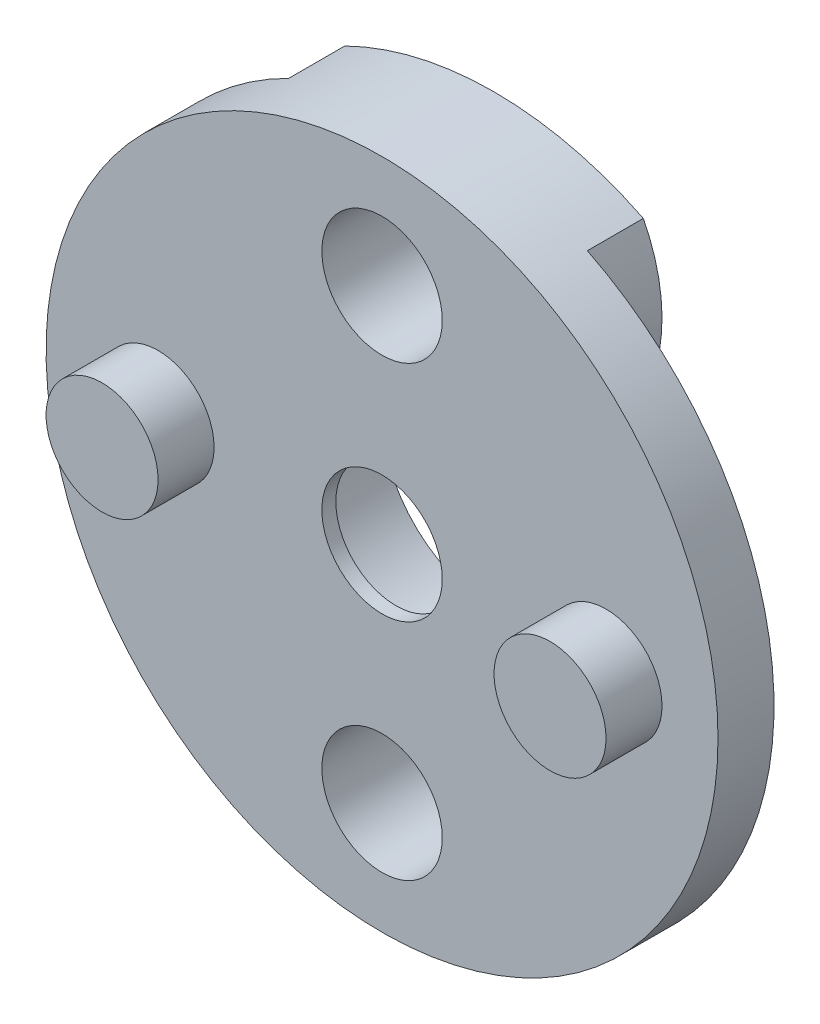
ISO-10303-21;
HEADER;
FILE_DESCRIPTION(('STEP AP214'),'2;1');
FILE_NAME('part.step','',(''),(''),'','','');
FILE_SCHEMA(('AUTOMOTIVE_DESIGN { 1 0 10303 214 1 1 1 1 }'));
ENDSEC;
DATA;
#1=APPLICATION_CONTEXT('core data for automotive mechanical design processes');
#2=APPLICATION_PROTOCOL_DEFINITION('international standard','automotive_design',2000,#1);
#3=PRODUCT_CONTEXT('',#1,'mechanical');
#4=PRODUCT('Part','Part','',(#3));
#5=PRODUCT_RELATED_PRODUCT_CATEGORY('part','',(#4));
#6=PRODUCT_DEFINITION_FORMATION('','',#4);
#7=PRODUCT_DEFINITION_CONTEXT('part definition',#1,'design');
#8=PRODUCT_DEFINITION('design','',#6,#7);
#9=PRODUCT_DEFINITION_SHAPE('','',#8);
#10=(LENGTH_UNIT() NAMED_UNIT(*) SI_UNIT(.MILLI.,.METRE.));
#11=(NAMED_UNIT(*) PLANE_ANGLE_UNIT() SI_UNIT($,.RADIAN.));
#12=(NAMED_UNIT(*) SI_UNIT($,.STERADIAN.) SOLID_ANGLE_UNIT());
#13=UNCERTAINTY_MEASURE_WITH_UNIT(LENGTH_MEASURE(1.E-05),#10,'distance_accuracy_value','');
#14=(GEOMETRIC_REPRESENTATION_CONTEXT(3) GLOBAL_UNCERTAINTY_ASSIGNED_CONTEXT((#13)) GLOBAL_UNIT_ASSIGNED_CONTEXT((#10,
#11,#12)) REPRESENTATION_CONTEXT('',''));
#15=CARTESIAN_POINT('',(0.,0.,0.));
#16=DIRECTION('',(0.,0.,1.));
#17=DIRECTION('',(1.,0.,0.));
#18=AXIS2_PLACEMENT_3D('',#15,#16,#17);
#19=CARTESIAN_POINT('',(0.,0.,2.));
#20=DIRECTION('',(0.,0.,1.));
#21=DIRECTION('',(1.,0.,0.));
#22=AXIS2_PLACEMENT_3D('',#19,#20,#21);
#23=CYLINDRICAL_SURFACE('',#22,2.14999999999999);
#24=CARTESIAN_POINT('',(0.,0.,2.));
#25=DIRECTION('',(0.,0.,1.));
#26=DIRECTION('',(1.,0.,0.));
#27=AXIS2_PLACEMENT_3D('',#24,#25,#26);
#28=CIRCLE('',#27,2.14999999999999);
#29=CARTESIAN_POINT('',(2.14999999999999,0.,2.));
#30=VERTEX_POINT('',#29);
#31=EDGE_CURVE('E128',#30,#30,#28,.T.);
#32=ORIENTED_EDGE('',*,*,#31,.T.);
#33=EDGE_LOOP('',(#32));
#34=FACE_BOUND('',#33,.T.);
#35=CARTESIAN_POINT('',(0.,0.,1.5));
#36=DIRECTION('',(0.,0.,-1.));
#37=DIRECTION('',(-1.,0.,0.));
#38=AXIS2_PLACEMENT_3D('',#35,#36,#37);
#39=CIRCLE('',#38,2.14999999999999);
#40=CARTESIAN_POINT('',(-2.14999999999999,0.,1.5));
#41=VERTEX_POINT('',#40);
#42=EDGE_CURVE('E39',#41,#41,#39,.F.);
#43=ORIENTED_EDGE('',*,*,#42,.F.);
#44=EDGE_LOOP('',(#43));
#45=FACE_BOUND('',#44,.T.);
#46=ADVANCED_FACE('F35',(#34,#45),#23,.F.);
#47=CARTESIAN_POINT('',(0.,0.,0.));
#48=DIRECTION('',(0.,0.,1.));
#49=DIRECTION('',(1.,0.,0.));
#50=AXIS2_PLACEMENT_3D('',#47,#48,#49);
#51=PLANE('',#50);
#52=CARTESIAN_POINT('',(0.,8.,0.));
#53=DIRECTION('',(0.,0.,-1.));
#54=DIRECTION('',(-1.,0.,0.));
#55=AXIS2_PLACEMENT_3D('',#52,#53,#54);
#56=CIRCLE('',#55,6.);
#57=CARTESIAN_POINT('',(-4.47213595499958,4.,0.));
#58=VERTEX_POINT('',#57);
#59=CARTESIAN_POINT('',(-5.33268225192539,10.75,0.));
#60=VERTEX_POINT('',#59);
#61=EDGE_CURVE('E52',#58,#60,#56,.T.);
#62=ORIENTED_EDGE('',*,*,#61,.F.);
#63=CARTESIAN_POINT('',(0.,0.,0.));
#64=DIRECTION('',(0.,0.,-1.));
#65=DIRECTION('',(-1.,0.,0.));
#66=AXIS2_PLACEMENT_3D('',#63,#64,#65);
#67=CIRCLE('',#66,6.);
#68=CARTESIAN_POINT('',(-4.47213595499958,-4.,0.));
#69=VERTEX_POINT('',#68);
#70=EDGE_CURVE('E56',#69,#58,#67,.T.);
#71=ORIENTED_EDGE('',*,*,#70,.F.);
#72=CARTESIAN_POINT('',(0.,-8.,0.));
#73=DIRECTION('',(0.,0.,-1.));
#74=DIRECTION('',(-1.,0.,0.));
#75=AXIS2_PLACEMENT_3D('',#72,#73,#74);
#76=CIRCLE('',#75,6.);
#77=CARTESIAN_POINT('',(-5.33268225192539,-10.75,0.));
#78=VERTEX_POINT('',#77);
#79=EDGE_CURVE('E160',#78,#69,#76,.T.);
#80=ORIENTED_EDGE('',*,*,#79,.F.);
#81=CARTESIAN_POINT('',(0.,0.,0.));
#82=DIRECTION('',(0.,0.,1.));
#83=DIRECTION('',(1.,0.,0.));
#84=AXIS2_PLACEMENT_3D('',#81,#82,#83);
#85=CIRCLE('',#84,12.);
#86=EDGE_CURVE('E44',#60,#78,#85,.T.);
#87=ORIENTED_EDGE('',*,*,#86,.F.);
#88=EDGE_LOOP('',(#62,#71,#80,#87));
#89=FACE_BOUND('',#88,.T.);
#90=ADVANCED_FACE('F227',(#89),#51,.F.);
#91=CARTESIAN_POINT('',(0.,0.,2.));
#92=DIRECTION('',(0.,0.,-1.));
#93=DIRECTION('',(-1.,0.,0.));
#94=AXIS2_PLACEMENT_3D('',#91,#92,#93);
#95=CYLINDRICAL_SURFACE('',#94,12.);
#96=CARTESIAN_POINT('',(0.,0.,2.));
#97=DIRECTION('',(0.,0.,1.));
#98=DIRECTION('',(1.,0.,0.));
#99=AXIS2_PLACEMENT_3D('',#96,#97,#98);
#100=CIRCLE('',#99,12.);
#101=CARTESIAN_POINT('',(12.,0.,2.));
#102=VERTEX_POINT('',#101);
#103=EDGE_CURVE('E11',#102,#102,#100,.T.);
#104=ORIENTED_EDGE('',*,*,#103,.F.);
#105=EDGE_LOOP('',(#104));
#106=FACE_BOUND('',#105,.T.);
#107=CARTESIAN_POINT('',(5.33268225192539,-10.75,0.));
#108=VERTEX_POINT('',#107);
#109=CARTESIAN_POINT('',(5.33268225192539,10.75,0.));
#110=VERTEX_POINT('',#109);
#111=EDGE_CURVE('E124',#108,#110,#85,.T.);
#112=ORIENTED_EDGE('',*,*,#111,.T.);
#113=DIRECTION('',(0.,0.,1.));
#114=VECTOR('',#113,1.);
#115=CARTESIAN_POINT('',(5.33268225192538,10.75,-2.));
#116=LINE('',#115,#114);
#117=CARTESIAN_POINT('',(5.33268225192538,10.75,-2.));
#118=VERTEX_POINT('',#117);
#119=EDGE_CURVE('E105',#118,#110,#116,.T.);
#120=ORIENTED_EDGE('',*,*,#119,.F.);
#121=CARTESIAN_POINT('',(0.,0.,-2.));
#122=DIRECTION('',(0.,0.,-1.));
#123=DIRECTION('',(-1.,0.,0.));
#124=AXIS2_PLACEMENT_3D('',#121,#122,#123);
#125=CIRCLE('',#124,12.);
#126=CARTESIAN_POINT('',(-5.33268225192538,10.75,-2.));
#127=VERTEX_POINT('',#126);
#128=EDGE_CURVE('E111',#127,#118,#125,.T.);
#129=ORIENTED_EDGE('',*,*,#128,.F.);
#130=DIRECTION('',(0.,0.,1.));
#131=VECTOR('',#130,1.);
#132=CARTESIAN_POINT('',(-5.33268225192538,10.75,-2.));
#133=LINE('',#132,#131);
#134=EDGE_CURVE('E156',#127,#60,#133,.T.);
#135=ORIENTED_EDGE('',*,*,#134,.T.);
#136=ORIENTED_EDGE('',*,*,#86,.T.);
#137=DIRECTION('',(0.,0.,1.));
#138=VECTOR('',#137,1.);
#139=CARTESIAN_POINT('',(-5.33268225192538,-10.75,-2.));
#140=LINE('',#139,#138);
#141=CARTESIAN_POINT('',(-5.33268225192538,-10.75,-2.));
#142=VERTEX_POINT('',#141);
#143=EDGE_CURVE('E154',#142,#78,#140,.T.);
#144=ORIENTED_EDGE('',*,*,#143,.F.);
#145=CARTESIAN_POINT('',(0.,0.,-2.));
#146=DIRECTION('',(0.,0.,-1.));
#147=DIRECTION('',(-1.,0.,0.));
#148=AXIS2_PLACEMENT_3D('',#145,#146,#147);
#149=CIRCLE('',#148,12.);
#150=CARTESIAN_POINT('',(5.33268225192539,-10.75,-2.));
#151=VERTEX_POINT('',#150);
#152=EDGE_CURVE('E203',#151,#142,#149,.T.);
#153=ORIENTED_EDGE('',*,*,#152,.F.);
#154=DIRECTION('',(0.,0.,1.));
#155=VECTOR('',#154,1.);
#156=CARTESIAN_POINT('',(5.33268225192539,-10.75,-2.));
#157=LINE('',#156,#155);
#158=EDGE_CURVE('E163',#151,#108,#157,.T.);
#159=ORIENTED_EDGE('',*,*,#158,.T.);
#160=EDGE_LOOP('',(#112,#120,#129,#135,#136,#144,#153,#159));
#161=FACE_BOUND('',#160,.T.);
#162=ADVANCED_FACE('F37',(#106,#161),#95,.T.);
#163=CARTESIAN_POINT('',(0.,0.,2.));
#164=DIRECTION('',(0.,0.,1.));
#165=DIRECTION('',(1.,0.,0.));
#166=AXIS2_PLACEMENT_3D('',#163,#164,#165);
#167=PLANE('',#166);
#168=CARTESIAN_POINT('',(0.,8.,2.));
#169=DIRECTION('',(0.,0.,1.));
#170=DIRECTION('',(1.,0.,0.));
#171=AXIS2_PLACEMENT_3D('',#168,#169,#170);
#172=CIRCLE('',#171,2.14999999999999);
#173=CARTESIAN_POINT('',(2.14999999999999,8.,2.));
#174=VERTEX_POINT('',#173);
#175=EDGE_CURVE('E125',#174,#174,#172,.T.);
#176=ORIENTED_EDGE('',*,*,#175,.F.);
#177=EDGE_LOOP('',(#176));
#178=FACE_BOUND('',#177,.T.);
#179=ORIENTED_EDGE('',*,*,#31,.F.);
#180=EDGE_LOOP('',(#179));
#181=FACE_BOUND('',#180,.T.);
#182=CARTESIAN_POINT('',(0.,-8.,2.));
#183=DIRECTION('',(0.,0.,1.));
#184=DIRECTION('',(1.,0.,0.));
#185=AXIS2_PLACEMENT_3D('',#182,#183,#184);
#186=CIRCLE('',#185,2.14999999999999);
#187=CARTESIAN_POINT('',(2.14999999999999,-8.,2.));
#188=VERTEX_POINT('',#187);
#189=EDGE_CURVE('E136',#188,#188,#186,.T.);
#190=ORIENTED_EDGE('',*,*,#189,.F.);
#191=EDGE_LOOP('',(#190));
#192=FACE_BOUND('',#191,.T.);
#193=CARTESIAN_POINT('',(8.,0.,2.));
#194=DIRECTION('',(0.,0.,1.));
#195=DIRECTION('',(1.,0.,0.));
#196=AXIS2_PLACEMENT_3D('',#193,#194,#195);
#197=CIRCLE('',#196,2.);
#198=CARTESIAN_POINT('',(10.,0.,2.));
#199=VERTEX_POINT('',#198);
#200=EDGE_CURVE('E139',#199,#199,#197,.T.);
#201=ORIENTED_EDGE('',*,*,#200,.F.);
#202=EDGE_LOOP('',(#201));
#203=FACE_BOUND('',#202,.T.);
#204=CARTESIAN_POINT('',(-8.,0.,2.));
#205=DIRECTION('',(0.,0.,1.));
#206=DIRECTION('',(1.,0.,0.));
#207=AXIS2_PLACEMENT_3D('',#204,#205,#206);
#208=CIRCLE('',#207,2.);
#209=CARTESIAN_POINT('',(-6.,0.,2.));
#210=VERTEX_POINT('',#209);
#211=EDGE_CURVE('E143',#210,#210,#208,.T.);
#212=ORIENTED_EDGE('',*,*,#211,.F.);
#213=EDGE_LOOP('',(#212));
#214=FACE_BOUND('',#213,.T.);
#215=ORIENTED_EDGE('',*,*,#103,.T.);
#216=EDGE_LOOP('',(#215));
#217=FACE_BOUND('',#216,.T.);
#218=ADVANCED_FACE('F258',(#178,#181,#192,#203,#214,#217),#167,.T.);
#219=CARTESIAN_POINT('',(0.,-8.,0.));
#220=DIRECTION('',(0.,0.,-1.));
#221=DIRECTION('',(-1.,0.,0.));
#222=AXIS2_PLACEMENT_3D('',#219,#220,#221);
#223=CIRCLE('',#222,6.);
#224=CARTESIAN_POINT('',(4.47213595499958,-4.,0.));
#225=VERTEX_POINT('',#224);
#226=EDGE_CURVE('E177',#225,#108,#223,.T.);
#227=ORIENTED_EDGE('',*,*,#226,.F.);
#228=CARTESIAN_POINT('',(0.,0.,0.));
#229=DIRECTION('',(0.,0.,-1.));
#230=DIRECTION('',(-1.,0.,0.));
#231=AXIS2_PLACEMENT_3D('',#228,#229,#230);
#232=CIRCLE('',#231,6.);
#233=CARTESIAN_POINT('',(4.47213595499958,4.,0.));
#234=VERTEX_POINT('',#233);
#235=EDGE_CURVE('E182',#234,#225,#232,.T.);
#236=ORIENTED_EDGE('',*,*,#235,.F.);
#237=CARTESIAN_POINT('',(0.,8.,0.));
#238=DIRECTION('',(0.,0.,-1.));
#239=DIRECTION('',(-1.,0.,0.));
#240=AXIS2_PLACEMENT_3D('',#237,#238,#239);
#241=CIRCLE('',#240,6.);
#242=EDGE_CURVE('E184',#110,#234,#241,.T.);
#243=ORIENTED_EDGE('',*,*,#242,.F.);
#244=ORIENTED_EDGE('',*,*,#111,.F.);
#245=EDGE_LOOP('',(#227,#236,#243,#244));
#246=FACE_BOUND('',#245,.T.);
#247=ADVANCED_FACE('F233',(#246),#51,.F.);
#248=CARTESIAN_POINT('',(-8.,0.,4.));
#249=DIRECTION('',(0.,0.,-1.));
#250=DIRECTION('',(-1.,0.,0.));
#251=AXIS2_PLACEMENT_3D('',#248,#249,#250);
#252=CYLINDRICAL_SURFACE('',#251,2.);
#253=CARTESIAN_POINT('',(-8.,0.,4.));
#254=DIRECTION('',(0.,0.,1.));
#255=DIRECTION('',(1.,0.,0.));
#256=AXIS2_PLACEMENT_3D('',#253,#254,#255);
#257=CIRCLE('',#256,2.);
#258=CARTESIAN_POINT('',(-6.,0.,4.));
#259=VERTEX_POINT('',#258);
#260=EDGE_CURVE('E146',#259,#259,#257,.T.);
#261=ORIENTED_EDGE('',*,*,#260,.F.);
#262=EDGE_LOOP('',(#261));
#263=FACE_BOUND('',#262,.T.);
#264=ORIENTED_EDGE('',*,*,#211,.T.);
#265=EDGE_LOOP('',(#264));
#266=FACE_BOUND('',#265,.T.);
#267=ADVANCED_FACE('F253',(#263,#266),#252,.T.);
#268=CARTESIAN_POINT('',(-8.,0.,4.));
#269=DIRECTION('',(0.,0.,1.));
#270=DIRECTION('',(1.,0.,0.));
#271=AXIS2_PLACEMENT_3D('',#268,#269,#270);
#272=PLANE('',#271);
#273=ORIENTED_EDGE('',*,*,#260,.T.);
#274=EDGE_LOOP('',(#273));
#275=FACE_BOUND('',#274,.T.);
#276=ADVANCED_FACE('F249',(#275),#272,.T.);
#277=CARTESIAN_POINT('',(8.,0.,4.));
#278=DIRECTION('',(0.,0.,-1.));
#279=DIRECTION('',(-1.,0.,0.));
#280=AXIS2_PLACEMENT_3D('',#277,#278,#279);
#281=CYLINDRICAL_SURFACE('',#280,2.);
#282=CARTESIAN_POINT('',(8.,0.,4.));
#283=DIRECTION('',(0.,0.,1.));
#284=DIRECTION('',(1.,0.,0.));
#285=AXIS2_PLACEMENT_3D('',#282,#283,#284);
#286=CIRCLE('',#285,2.);
#287=CARTESIAN_POINT('',(10.,0.,4.));
#288=VERTEX_POINT('',#287);
#289=EDGE_CURVE('E140',#288,#288,#286,.T.);
#290=ORIENTED_EDGE('',*,*,#289,.F.);
#291=EDGE_LOOP('',(#290));
#292=FACE_BOUND('',#291,.T.);
#293=ORIENTED_EDGE('',*,*,#200,.T.);
#294=EDGE_LOOP('',(#293));
#295=FACE_BOUND('',#294,.T.);
#296=ADVANCED_FACE('F245',(#292,#295),#281,.T.);
#297=CARTESIAN_POINT('',(8.,0.,4.));
#298=DIRECTION('',(0.,0.,1.));
#299=DIRECTION('',(1.,0.,0.));
#300=AXIS2_PLACEMENT_3D('',#297,#298,#299);
#301=PLANE('',#300);
#302=ORIENTED_EDGE('',*,*,#289,.T.);
#303=EDGE_LOOP('',(#302));
#304=FACE_BOUND('',#303,.T.);
#305=ADVANCED_FACE('F241',(#304),#301,.T.);
#306=CARTESIAN_POINT('',(0.,-8.,2.));
#307=DIRECTION('',(0.,0.,1.));
#308=DIRECTION('',(1.,0.,0.));
#309=AXIS2_PLACEMENT_3D('',#306,#307,#308);
#310=CYLINDRICAL_SURFACE('',#309,2.14999999999999);
#311=ORIENTED_EDGE('',*,*,#189,.T.);
#312=EDGE_LOOP('',(#311));
#313=FACE_BOUND('',#312,.T.);
#314=CARTESIAN_POINT('',(0.,-8.,-2.));
#315=DIRECTION('',(0.,0.,-1.));
#316=DIRECTION('',(-1.,0.,0.));
#317=AXIS2_PLACEMENT_3D('',#314,#315,#316);
#318=CIRCLE('',#317,2.15);
#319=CARTESIAN_POINT('',(-2.15,-8.,-2.));
#320=VERTEX_POINT('',#319);
#321=EDGE_CURVE('E211',#320,#320,#318,.T.);
#322=ORIENTED_EDGE('',*,*,#321,.T.);
#323=EDGE_LOOP('',(#322));
#324=FACE_BOUND('',#323,.T.);
#325=ADVANCED_FACE('F238',(#313,#324),#310,.F.);
#326=CARTESIAN_POINT('',(0.,8.,2.));
#327=DIRECTION('',(0.,0.,1.));
#328=DIRECTION('',(1.,0.,0.));
#329=AXIS2_PLACEMENT_3D('',#326,#327,#328);
#330=CYLINDRICAL_SURFACE('',#329,2.14999999999999);
#331=ORIENTED_EDGE('',*,*,#175,.T.);
#332=EDGE_LOOP('',(#331));
#333=FACE_BOUND('',#332,.T.);
#334=CARTESIAN_POINT('',(0.,8.,-2.));
#335=DIRECTION('',(0.,0.,-1.));
#336=DIRECTION('',(-1.,0.,0.));
#337=AXIS2_PLACEMENT_3D('',#334,#335,#336);
#338=CIRCLE('',#337,2.15);
#339=CARTESIAN_POINT('',(-2.15,8.,-2.));
#340=VERTEX_POINT('',#339);
#341=EDGE_CURVE('E187',#340,#340,#338,.T.);
#342=ORIENTED_EDGE('',*,*,#341,.T.);
#343=EDGE_LOOP('',(#342));
#344=FACE_BOUND('',#343,.T.);
#345=ADVANCED_FACE('F236',(#333,#344),#330,.F.);
#346=CARTESIAN_POINT('',(0.,4.,-2.));
#347=DIRECTION('',(0.,0.,-1.));
#348=DIRECTION('',(-1.,0.,0.));
#349=AXIS2_PLACEMENT_3D('',#346,#347,#348);
#350=PLANE('',#349);
#351=ORIENTED_EDGE('',*,*,#321,.F.);
#352=EDGE_LOOP('',(#351));
#353=FACE_BOUND('',#352,.T.);
#354=ORIENTED_EDGE('',*,*,#128,.T.);
#355=CARTESIAN_POINT('',(0.,8.,-2.));
#356=DIRECTION('',(0.,0.,-1.));
#357=DIRECTION('',(-1.,0.,0.));
#358=AXIS2_PLACEMENT_3D('',#355,#356,#357);
#359=CIRCLE('',#358,6.);
#360=CARTESIAN_POINT('',(4.47213595499958,4.,-2.));
#361=VERTEX_POINT('',#360);
#362=EDGE_CURVE('E100',#118,#361,#359,.T.);
#363=ORIENTED_EDGE('',*,*,#362,.T.);
#364=CARTESIAN_POINT('',(0.,0.,-2.));
#365=DIRECTION('',(0.,0.,-1.));
#366=DIRECTION('',(-1.,0.,0.));
#367=AXIS2_PLACEMENT_3D('',#364,#365,#366);
#368=CIRCLE('',#367,6.);
#369=CARTESIAN_POINT('',(4.47213595499958,-4.,-2.));
#370=VERTEX_POINT('',#369);
#371=EDGE_CURVE('E110',#361,#370,#368,.T.);
#372=ORIENTED_EDGE('',*,*,#371,.T.);
#373=CARTESIAN_POINT('',(0.,-8.,-2.));
#374=DIRECTION('',(0.,0.,-1.));
#375=DIRECTION('',(-1.,0.,0.));
#376=AXIS2_PLACEMENT_3D('',#373,#374,#375);
#377=CIRCLE('',#376,6.);
#378=EDGE_CURVE('E178',#370,#151,#377,.T.);
#379=ORIENTED_EDGE('',*,*,#378,.T.);
#380=ORIENTED_EDGE('',*,*,#152,.T.);
#381=CARTESIAN_POINT('',(0.,-8.,-2.));
#382=DIRECTION('',(0.,0.,-1.));
#383=DIRECTION('',(-1.,0.,0.));
#384=AXIS2_PLACEMENT_3D('',#381,#382,#383);
#385=CIRCLE('',#384,6.);
#386=CARTESIAN_POINT('',(-4.47213595499958,-4.,-2.));
#387=VERTEX_POINT('',#386);
#388=EDGE_CURVE('E162',#142,#387,#385,.T.);
#389=ORIENTED_EDGE('',*,*,#388,.T.);
#390=CARTESIAN_POINT('',(0.,0.,-2.));
#391=DIRECTION('',(0.,0.,-1.));
#392=DIRECTION('',(-1.,0.,0.));
#393=AXIS2_PLACEMENT_3D('',#390,#391,#392);
#394=CIRCLE('',#393,6.);
#395=CARTESIAN_POINT('',(-4.47213595499958,4.,-2.));
#396=VERTEX_POINT('',#395);
#397=EDGE_CURVE('E201',#387,#396,#394,.T.);
#398=ORIENTED_EDGE('',*,*,#397,.T.);
#399=CARTESIAN_POINT('',(0.,8.,-2.));
#400=DIRECTION('',(0.,0.,-1.));
#401=DIRECTION('',(-1.,0.,0.));
#402=AXIS2_PLACEMENT_3D('',#399,#400,#401);
#403=CIRCLE('',#402,6.);
#404=EDGE_CURVE('E117',#396,#127,#403,.T.);
#405=ORIENTED_EDGE('',*,*,#404,.T.);
#406=EDGE_LOOP('',(#354,#363,#372,#379,#380,#389,#398,#405));
#407=FACE_BOUND('',#406,.T.);
#408=ORIENTED_EDGE('',*,*,#341,.F.);
#409=EDGE_LOOP('',(#408));
#410=FACE_BOUND('',#409,.T.);
#411=CARTESIAN_POINT('',(0.,0.,-2.));
#412=DIRECTION('',(0.,0.,-1.));
#413=DIRECTION('',(-1.,0.,0.));
#414=AXIS2_PLACEMENT_3D('',#411,#412,#413);
#415=CIRCLE('',#414,4.);
#416=CARTESIAN_POINT('',(-4.,0.,-2.));
#417=VERTEX_POINT('',#416);
#418=EDGE_CURVE('E214',#417,#417,#415,.T.);
#419=ORIENTED_EDGE('',*,*,#418,.F.);
#420=EDGE_LOOP('',(#419));
#421=FACE_BOUND('',#420,.T.);
#422=ADVANCED_FACE('F114',(#353,#407,#410,#421),#350,.T.);
#423=CARTESIAN_POINT('',(0.,8.,-2.));
#424=DIRECTION('',(0.,0.,1.));
#425=DIRECTION('',(1.,0.,0.));
#426=AXIS2_PLACEMENT_3D('',#423,#424,#425);
#427=CYLINDRICAL_SURFACE('',#426,6.);
#428=ORIENTED_EDGE('',*,*,#242,.T.);
#429=DIRECTION('',(0.,0.,1.));
#430=VECTOR('',#429,1.);
#431=CARTESIAN_POINT('',(4.47213595499958,4.,-2.));
#432=LINE('',#431,#430);
#433=EDGE_CURVE('E107',#361,#234,#432,.T.);
#434=ORIENTED_EDGE('',*,*,#433,.F.);
#435=ORIENTED_EDGE('',*,*,#362,.F.);
#436=ORIENTED_EDGE('',*,*,#119,.T.);
#437=EDGE_LOOP('',(#428,#434,#435,#436));
#438=FACE_BOUND('',#437,.T.);
#439=ADVANCED_FACE('F103',(#438),#427,.T.);
#440=CARTESIAN_POINT('',(0.,0.,-2.));
#441=DIRECTION('',(0.,0.,1.));
#442=DIRECTION('',(1.,0.,0.));
#443=AXIS2_PLACEMENT_3D('',#440,#441,#442);
#444=CYLINDRICAL_SURFACE('',#443,6.);
#445=ORIENTED_EDGE('',*,*,#235,.T.);
#446=DIRECTION('',(0.,0.,1.));
#447=VECTOR('',#446,1.);
#448=CARTESIAN_POINT('',(4.47213595499958,-4.,-2.));
#449=LINE('',#448,#447);
#450=EDGE_CURVE('E130',#370,#225,#449,.T.);
#451=ORIENTED_EDGE('',*,*,#450,.F.);
#452=ORIENTED_EDGE('',*,*,#371,.F.);
#453=ORIENTED_EDGE('',*,*,#433,.T.);
#454=EDGE_LOOP('',(#445,#451,#452,#453));
#455=FACE_BOUND('',#454,.T.);
#456=ADVANCED_FACE('F181',(#455),#444,.T.);
#457=CARTESIAN_POINT('',(0.,-8.,-2.));
#458=DIRECTION('',(0.,0.,1.));
#459=DIRECTION('',(1.,0.,0.));
#460=AXIS2_PLACEMENT_3D('',#457,#458,#459);
#461=CYLINDRICAL_SURFACE('',#460,6.);
#462=ORIENTED_EDGE('',*,*,#226,.T.);
#463=ORIENTED_EDGE('',*,*,#158,.F.);
#464=ORIENTED_EDGE('',*,*,#378,.F.);
#465=ORIENTED_EDGE('',*,*,#450,.T.);
#466=EDGE_LOOP('',(#462,#463,#464,#465));
#467=FACE_BOUND('',#466,.T.);
#468=ADVANCED_FACE('F175',(#467),#461,.T.);
#469=CARTESIAN_POINT('',(0.,-8.,-2.));
#470=DIRECTION('',(0.,0.,1.));
#471=DIRECTION('',(1.,0.,0.));
#472=AXIS2_PLACEMENT_3D('',#469,#470,#471);
#473=CYLINDRICAL_SURFACE('',#472,6.);
#474=ORIENTED_EDGE('',*,*,#79,.T.);
#475=DIRECTION('',(0.,0.,1.));
#476=VECTOR('',#475,1.);
#477=CARTESIAN_POINT('',(-4.47213595499958,-4.,-2.));
#478=LINE('',#477,#476);
#479=EDGE_CURVE('E164',#387,#69,#478,.T.);
#480=ORIENTED_EDGE('',*,*,#479,.F.);
#481=ORIENTED_EDGE('',*,*,#388,.F.);
#482=ORIENTED_EDGE('',*,*,#143,.T.);
#483=EDGE_LOOP('',(#474,#480,#481,#482));
#484=FACE_BOUND('',#483,.T.);
#485=ADVANCED_FACE('F158',(#484),#473,.T.);
#486=CARTESIAN_POINT('',(0.,0.,-2.));
#487=DIRECTION('',(0.,0.,1.));
#488=DIRECTION('',(1.,0.,0.));
#489=AXIS2_PLACEMENT_3D('',#486,#487,#488);
#490=CYLINDRICAL_SURFACE('',#489,6.);
#491=ORIENTED_EDGE('',*,*,#70,.T.);
#492=DIRECTION('',(0.,0.,1.));
#493=VECTOR('',#492,1.);
#494=CARTESIAN_POINT('',(-4.47213595499958,4.,-2.));
#495=LINE('',#494,#493);
#496=EDGE_CURVE('E167',#396,#58,#495,.T.);
#497=ORIENTED_EDGE('',*,*,#496,.F.);
#498=ORIENTED_EDGE('',*,*,#397,.F.);
#499=ORIENTED_EDGE('',*,*,#479,.T.);
#500=EDGE_LOOP('',(#491,#497,#498,#499));
#501=FACE_BOUND('',#500,.T.);
#502=ADVANCED_FACE('F200',(#501),#490,.T.);
#503=CARTESIAN_POINT('',(0.,8.,-2.));
#504=DIRECTION('',(0.,0.,1.));
#505=DIRECTION('',(1.,0.,0.));
#506=AXIS2_PLACEMENT_3D('',#503,#504,#505);
#507=CYLINDRICAL_SURFACE('',#506,6.);
#508=ORIENTED_EDGE('',*,*,#61,.T.);
#509=ORIENTED_EDGE('',*,*,#134,.F.);
#510=ORIENTED_EDGE('',*,*,#404,.F.);
#511=ORIENTED_EDGE('',*,*,#496,.T.);
#512=EDGE_LOOP('',(#508,#509,#510,#511));
#513=FACE_BOUND('',#512,.T.);
#514=ADVANCED_FACE('F197',(#513),#507,.T.);
#515=CARTESIAN_POINT('',(0.,0.,-2.));
#516=DIRECTION('',(0.,0.,1.));
#517=DIRECTION('',(1.,0.,0.));
#518=AXIS2_PLACEMENT_3D('',#515,#516,#517);
#519=CYLINDRICAL_SURFACE('',#518,4.);
#520=ORIENTED_EDGE('',*,*,#418,.T.);
#521=EDGE_LOOP('',(#520));
#522=FACE_BOUND('',#521,.T.);
#523=CARTESIAN_POINT('',(0.,0.,1.5));
#524=DIRECTION('',(0.,0.,-1.));
#525=DIRECTION('',(-1.,0.,0.));
#526=AXIS2_PLACEMENT_3D('',#523,#524,#525);
#527=CIRCLE('',#526,4.);
#528=CARTESIAN_POINT('',(-4.,0.,1.5));
#529=VERTEX_POINT('',#528);
#530=EDGE_CURVE('E217',#529,#529,#527,.T.);
#531=ORIENTED_EDGE('',*,*,#530,.F.);
#532=EDGE_LOOP('',(#531));
#533=FACE_BOUND('',#532,.T.);
#534=ADVANCED_FACE('F336',(#522,#533),#519,.F.);
#535=CARTESIAN_POINT('',(0.,0.,1.5));
#536=DIRECTION('',(0.,0.,-1.));
#537=DIRECTION('',(-1.,0.,0.));
#538=AXIS2_PLACEMENT_3D('',#535,#536,#537);
#539=PLANE('',#538);
#540=ORIENTED_EDGE('',*,*,#530,.T.);
#541=EDGE_LOOP('',(#540));
#542=FACE_BOUND('',#541,.T.);
#543=ORIENTED_EDGE('',*,*,#42,.T.);
#544=EDGE_LOOP('',(#543));
#545=FACE_BOUND('',#544,.T.);
#546=ADVANCED_FACE('F224',(#542,#545),#539,.T.);
#547=CLOSED_SHELL('',(#46,#90,#162,#218,#247,#267,#276,#296,#305,#325,#345,#422,#439,#456,#468,
#485,#502,#514,#534,#546));
#548=MANIFOLD_SOLID_BREP('B2',#547);
#549=ADVANCED_BREP_SHAPE_REPRESENTATION('',(#18,#548),#14);
#550=SHAPE_DEFINITION_REPRESENTATION(#9,#549);
ENDSEC;
END-ISO-10303-21;
